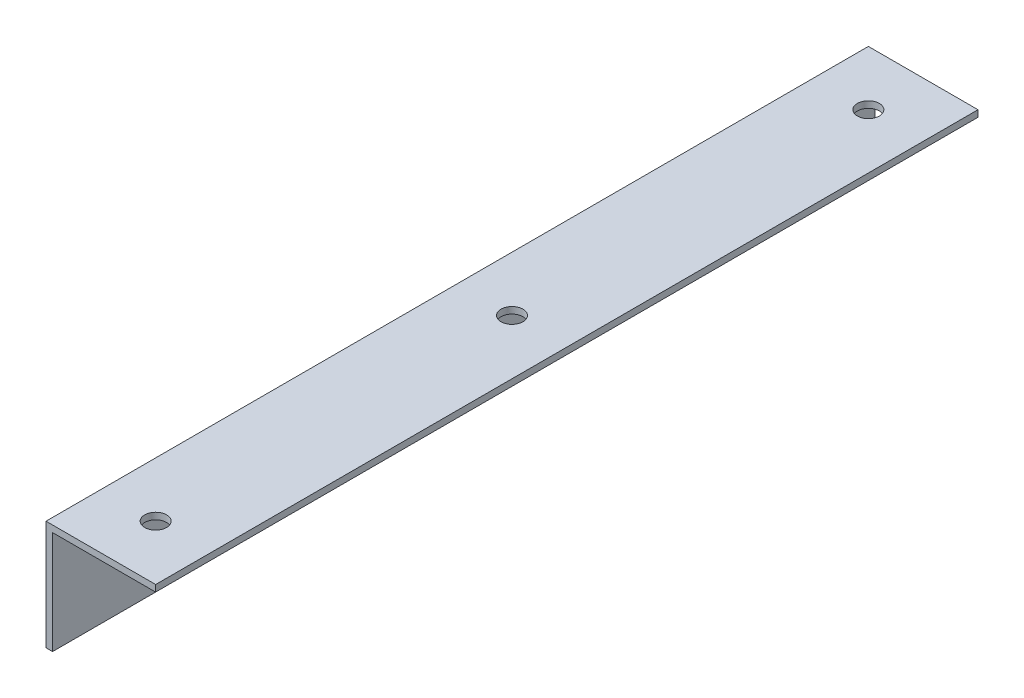
ISO-10303-21;
HEADER;
FILE_DESCRIPTION(('STEP AP214'),'2;1');
FILE_NAME('part.step','',(''),(''),'','','');
FILE_SCHEMA(('AUTOMOTIVE_DESIGN { 1 0 10303 214 1 1 1 1 }'));
ENDSEC;
DATA;
#1=APPLICATION_CONTEXT('core data for automotive mechanical design processes');
#2=APPLICATION_PROTOCOL_DEFINITION('international standard','automotive_design',2000,#1);
#3=PRODUCT_CONTEXT('',#1,'mechanical');
#4=PRODUCT('Part','Part','',(#3));
#5=PRODUCT_RELATED_PRODUCT_CATEGORY('part','',(#4));
#6=PRODUCT_DEFINITION_FORMATION('','',#4);
#7=PRODUCT_DEFINITION_CONTEXT('part definition',#1,'design');
#8=PRODUCT_DEFINITION('design','',#6,#7);
#9=PRODUCT_DEFINITION_SHAPE('','',#8);
#10=(LENGTH_UNIT() NAMED_UNIT(*) SI_UNIT(.MILLI.,.METRE.));
#11=(NAMED_UNIT(*) PLANE_ANGLE_UNIT() SI_UNIT($,.RADIAN.));
#12=(NAMED_UNIT(*) SI_UNIT($,.STERADIAN.) SOLID_ANGLE_UNIT());
#13=UNCERTAINTY_MEASURE_WITH_UNIT(LENGTH_MEASURE(1.E-05),#10,'distance_accuracy_value','');
#14=(GEOMETRIC_REPRESENTATION_CONTEXT(3) GLOBAL_UNCERTAINTY_ASSIGNED_CONTEXT((#13)) GLOBAL_UNIT_ASSIGNED_CONTEXT((#10,
#11,#12)) REPRESENTATION_CONTEXT('',''));
#15=CARTESIAN_POINT('',(0.,0.,0.));
#16=DIRECTION('',(0.,0.,1.));
#17=DIRECTION('',(1.,0.,0.));
#18=AXIS2_PLACEMENT_3D('',#15,#16,#17);
#19=CARTESIAN_POINT('',(0.,0.,150.));
#20=DIRECTION('',(0.,1.,0.));
#21=DIRECTION('',(0.,0.,1.));
#22=AXIS2_PLACEMENT_3D('',#19,#20,#21);
#23=PLANE('',#22);
#24=DIRECTION('',(1.,0.,0.));
#25=VECTOR('',#24,1.);
#26=CARTESIAN_POINT('',(0.,0.,0.));
#27=LINE('',#26,#25);
#28=CARTESIAN_POINT('',(0.,0.,0.));
#29=VERTEX_POINT('',#28);
#30=CARTESIAN_POINT('',(1.2,0.,0.));
#31=VERTEX_POINT('',#30);
#32=EDGE_CURVE('E117',#29,#31,#27,.T.);
#33=ORIENTED_EDGE('',*,*,#32,.T.);
#34=DIRECTION('',(0.,0.,-1.));
#35=VECTOR('',#34,1.);
#36=CARTESIAN_POINT('',(1.2,0.,150.));
#37=LINE('',#36,#35);
#38=CARTESIAN_POINT('',(1.2,0.,150.));
#39=VERTEX_POINT('',#38);
#40=EDGE_CURVE('E11',#39,#31,#37,.T.);
#41=ORIENTED_EDGE('',*,*,#40,.F.);
#42=DIRECTION('',(1.,0.,0.));
#43=VECTOR('',#42,1.);
#44=CARTESIAN_POINT('',(0.,0.,150.));
#45=LINE('',#44,#43);
#46=CARTESIAN_POINT('',(0.,0.,150.));
#47=VERTEX_POINT('',#46);
#48=EDGE_CURVE('E128',#47,#39,#45,.T.);
#49=ORIENTED_EDGE('',*,*,#48,.F.);
#50=DIRECTION('',(0.,0.,-1.));
#51=VECTOR('',#50,1.);
#52=CARTESIAN_POINT('',(0.,0.,150.));
#53=LINE('',#52,#51);
#54=EDGE_CURVE('E113',#47,#29,#53,.T.);
#55=ORIENTED_EDGE('',*,*,#54,.T.);
#56=EDGE_LOOP('',(#33,#41,#49,#55));
#57=FACE_BOUND('',#56,.T.);
#58=ADVANCED_FACE('F33',(#57),#23,.F.);
#59=CARTESIAN_POINT('',(1.2,0.,150.));
#60=DIRECTION('',(-1.,0.,0.));
#61=DIRECTION('',(0.,0.,1.));
#62=AXIS2_PLACEMENT_3D('',#59,#60,#61);
#63=PLANE('',#62);
#64=DIRECTION('',(0.,1.,0.));
#65=VECTOR('',#64,1.);
#66=CARTESIAN_POINT('',(1.2,0.,0.));
#67=LINE('',#66,#65);
#68=CARTESIAN_POINT('',(1.2,18.8,0.));
#69=VERTEX_POINT('',#68);
#70=EDGE_CURVE('E120',#31,#69,#67,.T.);
#71=ORIENTED_EDGE('',*,*,#70,.T.);
#72=DIRECTION('',(0.,0.,-1.));
#73=VECTOR('',#72,1.);
#74=CARTESIAN_POINT('',(1.2,18.8,150.));
#75=LINE('',#74,#73);
#76=CARTESIAN_POINT('',(1.2,18.8,150.));
#77=VERTEX_POINT('',#76);
#78=EDGE_CURVE('E41',#77,#69,#75,.T.);
#79=ORIENTED_EDGE('',*,*,#78,.F.);
#80=DIRECTION('',(0.,1.,0.));
#81=VECTOR('',#80,1.);
#82=CARTESIAN_POINT('',(1.2,0.,150.));
#83=LINE('',#82,#81);
#84=EDGE_CURVE('E86',#39,#77,#83,.T.);
#85=ORIENTED_EDGE('',*,*,#84,.F.);
#86=ORIENTED_EDGE('',*,*,#40,.T.);
#87=EDGE_LOOP('',(#71,#79,#85,#86));
#88=FACE_BOUND('',#87,.T.);
#89=ADVANCED_FACE('F153',(#88),#63,.F.);
#90=CARTESIAN_POINT('',(1.2,18.8,150.));
#91=DIRECTION('',(0.,1.,0.));
#92=DIRECTION('',(-1.,0.,0.));
#93=AXIS2_PLACEMENT_3D('',#90,#91,#92);
#94=PLANE('',#93);
#95=CARTESIAN_POINT('',(10.,18.8,140.));
#96=DIRECTION('',(0.,1.,0.));
#97=DIRECTION('',(-1.,0.,0.));
#98=AXIS2_PLACEMENT_3D('',#95,#96,#97);
#99=CIRCLE('',#98,2.);
#100=CARTESIAN_POINT('',(8.,18.8,140.));
#101=VERTEX_POINT('',#100);
#102=EDGE_CURVE('E121',#101,#101,#99,.T.);
#103=ORIENTED_EDGE('',*,*,#102,.T.);
#104=EDGE_LOOP('',(#103));
#105=FACE_BOUND('',#104,.T.);
#106=CARTESIAN_POINT('',(10.,18.8,9.99999999999999));
#107=DIRECTION('',(0.,1.,0.));
#108=DIRECTION('',(-1.,0.,0.));
#109=AXIS2_PLACEMENT_3D('',#106,#107,#108);
#110=CIRCLE('',#109,2.);
#111=CARTESIAN_POINT('',(8.,18.8,9.99999999999999));
#112=VERTEX_POINT('',#111);
#113=EDGE_CURVE('E231',#112,#112,#110,.T.);
#114=ORIENTED_EDGE('',*,*,#113,.T.);
#115=EDGE_LOOP('',(#114));
#116=FACE_BOUND('',#115,.T.);
#117=CARTESIAN_POINT('',(10.,18.8,75.));
#118=DIRECTION('',(0.,1.,0.));
#119=DIRECTION('',(-1.,0.,0.));
#120=AXIS2_PLACEMENT_3D('',#117,#118,#119);
#121=CIRCLE('',#120,2.);
#122=CARTESIAN_POINT('',(8.,18.8,75.));
#123=VERTEX_POINT('',#122);
#124=EDGE_CURVE('E234',#123,#123,#121,.T.);
#125=ORIENTED_EDGE('',*,*,#124,.T.);
#126=EDGE_LOOP('',(#125));
#127=FACE_BOUND('',#126,.T.);
#128=DIRECTION('',(1.,0.,0.));
#129=VECTOR('',#128,1.);
#130=CARTESIAN_POINT('',(1.2,18.8,0.));
#131=LINE('',#130,#129);
#132=CARTESIAN_POINT('',(20.,18.8,0.));
#133=VERTEX_POINT('',#132);
#134=EDGE_CURVE('E123',#69,#133,#131,.T.);
#135=ORIENTED_EDGE('',*,*,#134,.T.);
#136=DIRECTION('',(0.,0.,-1.));
#137=VECTOR('',#136,1.);
#138=CARTESIAN_POINT('',(20.,18.8,150.));
#139=LINE('',#138,#137);
#140=CARTESIAN_POINT('',(20.,18.8,150.));
#141=VERTEX_POINT('',#140);
#142=EDGE_CURVE('E108',#141,#133,#139,.T.);
#143=ORIENTED_EDGE('',*,*,#142,.F.);
#144=DIRECTION('',(1.,0.,0.));
#145=VECTOR('',#144,1.);
#146=CARTESIAN_POINT('',(1.2,18.8,150.));
#147=LINE('',#146,#145);
#148=EDGE_CURVE('E99',#77,#141,#147,.T.);
#149=ORIENTED_EDGE('',*,*,#148,.F.);
#150=ORIENTED_EDGE('',*,*,#78,.T.);
#151=EDGE_LOOP('',(#135,#143,#149,#150));
#152=FACE_BOUND('',#151,.T.);
#153=ADVANCED_FACE('F134',(#105,#116,#127,#152),#94,.F.);
#154=CARTESIAN_POINT('',(20.,20.,150.));
#155=DIRECTION('',(-1.,0.,0.));
#156=DIRECTION('',(0.,-1.,0.));
#157=AXIS2_PLACEMENT_3D('',#154,#155,#156);
#158=PLANE('',#157);
#159=DIRECTION('',(0.,1.,0.));
#160=VECTOR('',#159,1.);
#161=CARTESIAN_POINT('',(20.,20.,0.));
#162=LINE('',#161,#160);
#163=CARTESIAN_POINT('',(20.,20.,0.));
#164=VERTEX_POINT('',#163);
#165=EDGE_CURVE('E107',#133,#164,#162,.T.);
#166=ORIENTED_EDGE('',*,*,#165,.T.);
#167=DIRECTION('',(0.,0.,-1.));
#168=VECTOR('',#167,1.);
#169=CARTESIAN_POINT('',(20.,20.,150.));
#170=LINE('',#169,#168);
#171=CARTESIAN_POINT('',(20.,20.,150.));
#172=VERTEX_POINT('',#171);
#173=EDGE_CURVE('E104',#172,#164,#170,.T.);
#174=ORIENTED_EDGE('',*,*,#173,.F.);
#175=DIRECTION('',(0.,1.,0.));
#176=VECTOR('',#175,1.);
#177=CARTESIAN_POINT('',(20.,20.,150.));
#178=LINE('',#177,#176);
#179=EDGE_CURVE('E93',#141,#172,#178,.T.);
#180=ORIENTED_EDGE('',*,*,#179,.F.);
#181=ORIENTED_EDGE('',*,*,#142,.T.);
#182=EDGE_LOOP('',(#166,#174,#180,#181));
#183=FACE_BOUND('',#182,.T.);
#184=ADVANCED_FACE('F105',(#183),#158,.F.);
#185=CARTESIAN_POINT('',(0.,20.,150.));
#186=DIRECTION('',(0.,-1.,0.));
#187=DIRECTION('',(0.,0.,-1.));
#188=AXIS2_PLACEMENT_3D('',#185,#186,#187);
#189=PLANE('',#188);
#190=CARTESIAN_POINT('',(10.,20.,140.));
#191=DIRECTION('',(0.,1.,0.));
#192=DIRECTION('',(0.,0.,1.));
#193=AXIS2_PLACEMENT_3D('',#190,#191,#192);
#194=CIRCLE('',#193,2.);
#195=CARTESIAN_POINT('',(10.,20.,142.));
#196=VERTEX_POINT('',#195);
#197=EDGE_CURVE('E228',#196,#196,#194,.T.);
#198=ORIENTED_EDGE('',*,*,#197,.F.);
#199=EDGE_LOOP('',(#198));
#200=FACE_BOUND('',#199,.T.);
#201=CARTESIAN_POINT('',(10.,20.,9.99999999999999));
#202=DIRECTION('',(0.,1.,0.));
#203=DIRECTION('',(0.,0.,1.));
#204=AXIS2_PLACEMENT_3D('',#201,#202,#203);
#205=CIRCLE('',#204,2.);
#206=CARTESIAN_POINT('',(10.,20.,12.));
#207=VERTEX_POINT('',#206);
#208=EDGE_CURVE('E244',#207,#207,#205,.T.);
#209=ORIENTED_EDGE('',*,*,#208,.F.);
#210=EDGE_LOOP('',(#209));
#211=FACE_BOUND('',#210,.T.);
#212=CARTESIAN_POINT('',(10.,20.,75.));
#213=DIRECTION('',(0.,1.,0.));
#214=DIRECTION('',(0.,0.,1.));
#215=AXIS2_PLACEMENT_3D('',#212,#213,#214);
#216=CIRCLE('',#215,2.);
#217=CARTESIAN_POINT('',(10.,20.,77.));
#218=VERTEX_POINT('',#217);
#219=EDGE_CURVE('E241',#218,#218,#216,.T.);
#220=ORIENTED_EDGE('',*,*,#219,.F.);
#221=EDGE_LOOP('',(#220));
#222=FACE_BOUND('',#221,.T.);
#223=DIRECTION('',(-1.,0.,0.));
#224=VECTOR('',#223,1.);
#225=CARTESIAN_POINT('',(0.,20.,0.));
#226=LINE('',#225,#224);
#227=CARTESIAN_POINT('',(0.,20.,0.));
#228=VERTEX_POINT('',#227);
#229=EDGE_CURVE('E72',#164,#228,#226,.T.);
#230=ORIENTED_EDGE('',*,*,#229,.T.);
#231=DIRECTION('',(0.,0.,-1.));
#232=VECTOR('',#231,1.);
#233=CARTESIAN_POINT('',(0.,20.,150.));
#234=LINE('',#233,#232);
#235=CARTESIAN_POINT('',(0.,20.,150.));
#236=VERTEX_POINT('',#235);
#237=EDGE_CURVE('E109',#236,#228,#234,.T.);
#238=ORIENTED_EDGE('',*,*,#237,.F.);
#239=DIRECTION('',(-1.,0.,0.));
#240=VECTOR('',#239,1.);
#241=CARTESIAN_POINT('',(0.,20.,150.));
#242=LINE('',#241,#240);
#243=EDGE_CURVE('E97',#172,#236,#242,.T.);
#244=ORIENTED_EDGE('',*,*,#243,.F.);
#245=ORIENTED_EDGE('',*,*,#173,.T.);
#246=EDGE_LOOP('',(#230,#238,#244,#245));
#247=FACE_BOUND('',#246,.T.);
#248=ADVANCED_FACE('F111',(#200,#211,#222,#247),#189,.F.);
#249=CARTESIAN_POINT('',(0.,0.,150.));
#250=DIRECTION('',(1.,0.,0.));
#251=DIRECTION('',(0.,0.,-1.));
#252=AXIS2_PLACEMENT_3D('',#249,#250,#251);
#253=PLANE('',#252);
#254=DIRECTION('',(0.,-1.,0.));
#255=VECTOR('',#254,1.);
#256=CARTESIAN_POINT('',(0.,0.,0.));
#257=LINE('',#256,#255);
#258=EDGE_CURVE('E78',#228,#29,#257,.T.);
#259=ORIENTED_EDGE('',*,*,#258,.T.);
#260=ORIENTED_EDGE('',*,*,#54,.F.);
#261=DIRECTION('',(0.,-1.,0.));
#262=VECTOR('',#261,1.);
#263=CARTESIAN_POINT('',(0.,0.,150.));
#264=LINE('',#263,#262);
#265=EDGE_CURVE('E49',#236,#47,#264,.T.);
#266=ORIENTED_EDGE('',*,*,#265,.F.);
#267=ORIENTED_EDGE('',*,*,#237,.T.);
#268=EDGE_LOOP('',(#259,#260,#266,#267));
#269=FACE_BOUND('',#268,.T.);
#270=ADVANCED_FACE('F141',(#269),#253,.F.);
#271=CARTESIAN_POINT('',(0.,0.,150.));
#272=DIRECTION('',(0.,0.,1.));
#273=DIRECTION('',(1.,0.,0.));
#274=AXIS2_PLACEMENT_3D('',#271,#272,#273);
#275=PLANE('',#274);
#276=ORIENTED_EDGE('',*,*,#48,.T.);
#277=ORIENTED_EDGE('',*,*,#84,.T.);
#278=ORIENTED_EDGE('',*,*,#148,.T.);
#279=ORIENTED_EDGE('',*,*,#179,.T.);
#280=ORIENTED_EDGE('',*,*,#243,.T.);
#281=ORIENTED_EDGE('',*,*,#265,.T.);
#282=EDGE_LOOP('',(#276,#277,#278,#279,#280,#281));
#283=FACE_BOUND('',#282,.T.);
#284=ADVANCED_FACE('F95',(#283),#275,.T.);
#285=CARTESIAN_POINT('',(0.,0.,0.));
#286=DIRECTION('',(0.,0.,1.));
#287=DIRECTION('',(1.,0.,0.));
#288=AXIS2_PLACEMENT_3D('',#285,#286,#287);
#289=PLANE('',#288);
#290=ORIENTED_EDGE('',*,*,#32,.F.);
#291=ORIENTED_EDGE('',*,*,#258,.F.);
#292=ORIENTED_EDGE('',*,*,#229,.F.);
#293=ORIENTED_EDGE('',*,*,#165,.F.);
#294=ORIENTED_EDGE('',*,*,#134,.F.);
#295=ORIENTED_EDGE('',*,*,#70,.F.);
#296=EDGE_LOOP('',(#290,#291,#292,#293,#294,#295));
#297=FACE_BOUND('',#296,.T.);
#298=ADVANCED_FACE('F137',(#297),#289,.F.);
#299=CARTESIAN_POINT('',(10.,10.,75.));
#300=DIRECTION('',(0.,1.,0.));
#301=DIRECTION('',(0.,0.,1.));
#302=AXIS2_PLACEMENT_3D('',#299,#300,#301);
#303=CYLINDRICAL_SURFACE('',#302,2.);
#304=ORIENTED_EDGE('',*,*,#219,.T.);
#305=EDGE_LOOP('',(#304));
#306=FACE_BOUND('',#305,.T.);
#307=ORIENTED_EDGE('',*,*,#124,.F.);
#308=EDGE_LOOP('',(#307));
#309=FACE_BOUND('',#308,.T.);
#310=ADVANCED_FACE('F181',(#306,#309),#303,.F.);
#311=CARTESIAN_POINT('',(10.,10.,9.99999999999999));
#312=DIRECTION('',(0.,1.,0.));
#313=DIRECTION('',(0.,0.,1.));
#314=AXIS2_PLACEMENT_3D('',#311,#312,#313);
#315=CYLINDRICAL_SURFACE('',#314,2.);
#316=ORIENTED_EDGE('',*,*,#208,.T.);
#317=EDGE_LOOP('',(#316));
#318=FACE_BOUND('',#317,.T.);
#319=ORIENTED_EDGE('',*,*,#113,.F.);
#320=EDGE_LOOP('',(#319));
#321=FACE_BOUND('',#320,.T.);
#322=ADVANCED_FACE('F186',(#318,#321),#315,.F.);
#323=CARTESIAN_POINT('',(10.,10.,140.));
#324=DIRECTION('',(0.,1.,0.));
#325=DIRECTION('',(0.,0.,1.));
#326=AXIS2_PLACEMENT_3D('',#323,#324,#325);
#327=CYLINDRICAL_SURFACE('',#326,2.);
#328=ORIENTED_EDGE('',*,*,#197,.T.);
#329=EDGE_LOOP('',(#328));
#330=FACE_BOUND('',#329,.T.);
#331=ORIENTED_EDGE('',*,*,#102,.F.);
#332=EDGE_LOOP('',(#331));
#333=FACE_BOUND('',#332,.T.);
#334=ADVANCED_FACE('F198',(#330,#333),#327,.F.);
#335=CLOSED_SHELL('',(#58,#89,#153,#184,#248,#270,#284,#298,#310,#322,#334));
#336=MANIFOLD_SOLID_BREP('B2',#335);
#337=ADVANCED_BREP_SHAPE_REPRESENTATION('',(#18,#336),#14);
#338=SHAPE_DEFINITION_REPRESENTATION(#9,#337);
ENDSEC;
END-ISO-10303-21;
